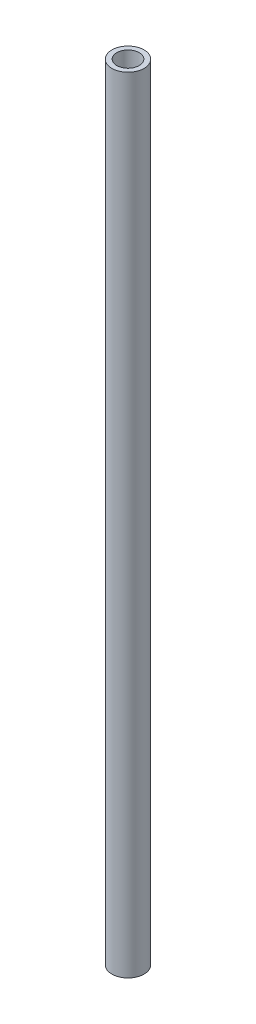
ISO-10303-21;
HEADER;
FILE_DESCRIPTION(('STEP AP214'),'2;1');
FILE_NAME('part.step','',(''),(''),'','','');
FILE_SCHEMA(('AUTOMOTIVE_DESIGN { 1 0 10303 214 1 1 1 1 }'));
ENDSEC;
DATA;
#1=APPLICATION_CONTEXT('core data for automotive mechanical design processes');
#2=APPLICATION_PROTOCOL_DEFINITION('international standard','automotive_design',2000,#1);
#3=PRODUCT_CONTEXT('',#1,'mechanical');
#4=PRODUCT('Part','Part','',(#3));
#5=PRODUCT_RELATED_PRODUCT_CATEGORY('part','',(#4));
#6=PRODUCT_DEFINITION_FORMATION('','',#4);
#7=PRODUCT_DEFINITION_CONTEXT('part definition',#1,'design');
#8=PRODUCT_DEFINITION('design','',#6,#7);
#9=PRODUCT_DEFINITION_SHAPE('','',#8);
#10=(LENGTH_UNIT() NAMED_UNIT(*) SI_UNIT(.MILLI.,.METRE.));
#11=(NAMED_UNIT(*) PLANE_ANGLE_UNIT() SI_UNIT($,.RADIAN.));
#12=(NAMED_UNIT(*) SI_UNIT($,.STERADIAN.) SOLID_ANGLE_UNIT());
#13=UNCERTAINTY_MEASURE_WITH_UNIT(LENGTH_MEASURE(1.E-05),#10,'distance_accuracy_value','');
#14=(GEOMETRIC_REPRESENTATION_CONTEXT(3) GLOBAL_UNCERTAINTY_ASSIGNED_CONTEXT((#13)) GLOBAL_UNIT_ASSIGNED_CONTEXT((#10,
#11,#12)) REPRESENTATION_CONTEXT('',''));
#15=CARTESIAN_POINT('',(0.,0.,0.));
#16=DIRECTION('',(0.,0.,1.));
#17=DIRECTION('',(1.,0.,0.));
#18=AXIS2_PLACEMENT_3D('',#15,#16,#17);
#19=CARTESIAN_POINT('',(0.,14.,0.));
#20=DIRECTION('',(0.,1.,0.));
#21=DIRECTION('',(0.,0.,1.));
#22=AXIS2_PLACEMENT_3D('',#19,#20,#21);
#23=PLANE('',#22);
#24=CARTESIAN_POINT('',(0.,14.,0.));
#25=DIRECTION('',(0.,1.,0.));
#26=DIRECTION('',(0.,0.,1.));
#27=AXIS2_PLACEMENT_3D('',#24,#25,#26);
#28=CIRCLE('',#27,0.28702);
#29=CARTESIAN_POINT('',(0.,14.,0.28702));
#30=VERTEX_POINT('',#29);
#31=EDGE_CURVE('E10',#30,#30,#28,.T.);
#32=ORIENTED_EDGE('',*,*,#31,.T.);
#33=EDGE_LOOP('',(#32));
#34=FACE_BOUND('',#33,.T.);
#35=CARTESIAN_POINT('',(0.,14.,0.));
#36=DIRECTION('',(0.,1.,0.));
#37=DIRECTION('',(0.,0.,1.));
#38=AXIS2_PLACEMENT_3D('',#35,#36,#37);
#39=CIRCLE('',#38,0.2);
#40=CARTESIAN_POINT('',(0.,14.,0.2));
#41=VERTEX_POINT('',#40);
#42=EDGE_CURVE('E42',#41,#41,#39,.T.);
#43=ORIENTED_EDGE('',*,*,#42,.F.);
#44=EDGE_LOOP('',(#43));
#45=FACE_BOUND('',#44,.T.);
#46=ADVANCED_FACE('F31',(#34,#45),#23,.T.);
#47=CARTESIAN_POINT('',(0.,0.,0.));
#48=DIRECTION('',(0.,1.,0.));
#49=DIRECTION('',(0.,0.,1.));
#50=AXIS2_PLACEMENT_3D('',#47,#48,#49);
#51=PLANE('',#50);
#52=CARTESIAN_POINT('',(0.,0.,0.));
#53=DIRECTION('',(0.,1.,0.));
#54=DIRECTION('',(0.,0.,1.));
#55=AXIS2_PLACEMENT_3D('',#52,#53,#54);
#56=CIRCLE('',#55,0.28702);
#57=CARTESIAN_POINT('',(0.,0.,0.28702));
#58=VERTEX_POINT('',#57);
#59=EDGE_CURVE('E35',#58,#58,#56,.T.);
#60=ORIENTED_EDGE('',*,*,#59,.F.);
#61=EDGE_LOOP('',(#60));
#62=FACE_BOUND('',#61,.T.);
#63=CARTESIAN_POINT('',(0.,0.,0.));
#64=DIRECTION('',(0.,1.,0.));
#65=DIRECTION('',(0.,0.,1.));
#66=AXIS2_PLACEMENT_3D('',#63,#64,#65);
#67=CIRCLE('',#66,0.2);
#68=CARTESIAN_POINT('',(0.,0.,0.2));
#69=VERTEX_POINT('',#68);
#70=EDGE_CURVE('E44',#69,#69,#67,.T.);
#71=ORIENTED_EDGE('',*,*,#70,.T.);
#72=EDGE_LOOP('',(#71));
#73=FACE_BOUND('',#72,.T.);
#74=ADVANCED_FACE('F54',(#62,#73),#51,.F.);
#75=CARTESIAN_POINT('',(0.,14.,0.));
#76=DIRECTION('',(0.,-1.,0.));
#77=DIRECTION('',(0.,0.,-1.));
#78=AXIS2_PLACEMENT_3D('',#75,#76,#77);
#79=CYLINDRICAL_SURFACE('',#78,0.28702);
#80=ORIENTED_EDGE('',*,*,#31,.F.);
#81=EDGE_LOOP('',(#80));
#82=FACE_BOUND('',#81,.T.);
#83=ORIENTED_EDGE('',*,*,#59,.T.);
#84=EDGE_LOOP('',(#83));
#85=FACE_BOUND('',#84,.T.);
#86=ADVANCED_FACE('F33',(#82,#85),#79,.T.);
#87=CARTESIAN_POINT('',(0.,14.,0.));
#88=DIRECTION('',(0.,-1.,0.));
#89=DIRECTION('',(0.,0.,-1.));
#90=AXIS2_PLACEMENT_3D('',#87,#88,#89);
#91=CYLINDRICAL_SURFACE('',#90,0.2);
#92=ORIENTED_EDGE('',*,*,#42,.T.);
#93=EDGE_LOOP('',(#92));
#94=FACE_BOUND('',#93,.T.);
#95=ORIENTED_EDGE('',*,*,#70,.F.);
#96=EDGE_LOOP('',(#95));
#97=FACE_BOUND('',#96,.T.);
#98=ADVANCED_FACE('F50',(#94,#97),#91,.F.);
#99=CLOSED_SHELL('',(#46,#74,#86,#98));
#100=MANIFOLD_SOLID_BREP('B2',#99);
#101=ADVANCED_BREP_SHAPE_REPRESENTATION('',(#18,#100),#14);
#102=SHAPE_DEFINITION_REPRESENTATION(#9,#101);
ENDSEC;
END-ISO-10303-21;
